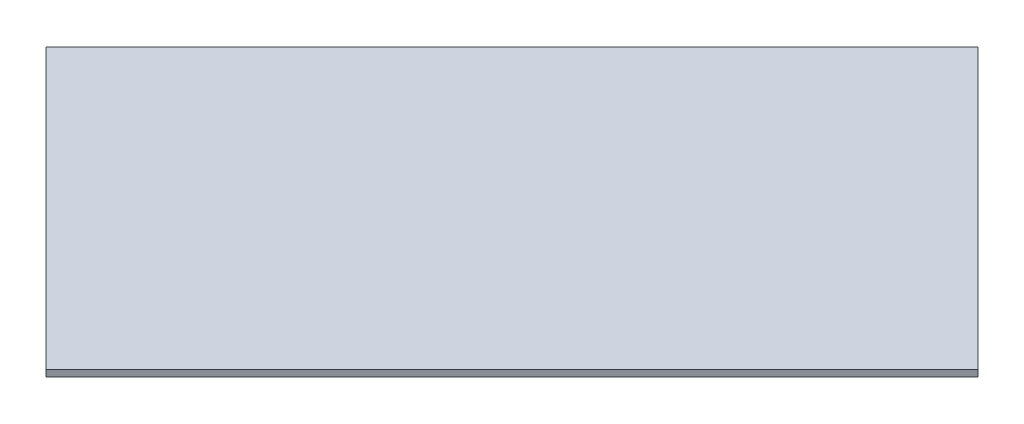
ISO-10303-21;
HEADER;
FILE_DESCRIPTION(('STEP AP214'),'2;1');
FILE_NAME('part.step','',(''),(''),'','','');
FILE_SCHEMA(('AUTOMOTIVE_DESIGN { 1 0 10303 214 1 1 1 1 }'));
ENDSEC;
DATA;
#1=APPLICATION_CONTEXT('core data for automotive mechanical design processes');
#2=APPLICATION_PROTOCOL_DEFINITION('international standard','automotive_design',2000,#1);
#3=PRODUCT_CONTEXT('',#1,'mechanical');
#4=PRODUCT('Part','Part','',(#3));
#5=PRODUCT_RELATED_PRODUCT_CATEGORY('part','',(#4));
#6=PRODUCT_DEFINITION_FORMATION('','',#4);
#7=PRODUCT_DEFINITION_CONTEXT('part definition',#1,'design');
#8=PRODUCT_DEFINITION('design','',#6,#7);
#9=PRODUCT_DEFINITION_SHAPE('','',#8);
#10=(LENGTH_UNIT() NAMED_UNIT(*) SI_UNIT(.MILLI.,.METRE.));
#11=(NAMED_UNIT(*) PLANE_ANGLE_UNIT() SI_UNIT($,.RADIAN.));
#12=(NAMED_UNIT(*) SI_UNIT($,.STERADIAN.) SOLID_ANGLE_UNIT());
#13=UNCERTAINTY_MEASURE_WITH_UNIT(LENGTH_MEASURE(1.E-05),#10,'distance_accuracy_value','');
#14=(GEOMETRIC_REPRESENTATION_CONTEXT(3) GLOBAL_UNCERTAINTY_ASSIGNED_CONTEXT((#13)) GLOBAL_UNIT_ASSIGNED_CONTEXT((#10,
#11,#12)) REPRESENTATION_CONTEXT('',''));
#15=CARTESIAN_POINT('',(0.,0.,0.));
#16=DIRECTION('',(0.,0.,1.));
#17=DIRECTION('',(1.,0.,0.));
#18=AXIS2_PLACEMENT_3D('',#15,#16,#17);
#19=CARTESIAN_POINT('',(-85.3553390593274,10.,-7.07106781186548));
#20=DIRECTION('',(-0.707106781186548,0.,0.707106781186547));
#21=DIRECTION('',(0.707106781186547,0.,0.707106781186548));
#22=AXIS2_PLACEMENT_3D('',#19,#20,#21);
#23=PLANE('',#22);
#24=DIRECTION('',(0.,1.,0.));
#25=VECTOR('',#24,1.);
#26=CARTESIAN_POINT('',(-85.3553390593274,10.,-7.07106781186548));
#27=LINE('',#26,#25);
#28=CARTESIAN_POINT('',(-85.3553390593274,10.,-7.07106781186548));
#29=VERTEX_POINT('',#28);
#30=CARTESIAN_POINT('',(-85.3553390593274,10.2,-7.07106781186548));
#31=VERTEX_POINT('',#30);
#32=EDGE_CURVE('E11',#29,#31,#27,.T.);
#33=ORIENTED_EDGE('',*,*,#32,.F.);
#34=DIRECTION('',(0.707106781186547,0.,0.707106781186548));
#35=VECTOR('',#34,1.);
#36=CARTESIAN_POINT('',(-85.3553390593274,10.,-7.07106781186548));
#37=LINE('',#36,#35);
#38=CARTESIAN_POINT('',(-76.8700576850888,10.,1.41421356237309));
#39=VERTEX_POINT('',#38);
#40=EDGE_CURVE('E88',#29,#39,#37,.T.);
#41=ORIENTED_EDGE('',*,*,#40,.T.);
#42=DIRECTION('',(0.,1.,0.));
#43=VECTOR('',#42,1.);
#44=CARTESIAN_POINT('',(-76.8700576850888,10.,1.41421356237309));
#45=LINE('',#44,#43);
#46=CARTESIAN_POINT('',(-76.8700576850888,10.2,1.41421356237309));
#47=VERTEX_POINT('',#46);
#48=EDGE_CURVE('E43',#39,#47,#45,.T.);
#49=ORIENTED_EDGE('',*,*,#48,.T.);
#50=DIRECTION('',(0.707106781186547,0.,0.707106781186548));
#51=VECTOR('',#50,1.);
#52=CARTESIAN_POINT('',(-85.3553390593274,10.2,-7.07106781186548));
#53=LINE('',#52,#51);
#54=EDGE_CURVE('E101',#31,#47,#53,.T.);
#55=ORIENTED_EDGE('',*,*,#54,.F.);
#56=EDGE_LOOP('',(#33,#41,#49,#55));
#57=FACE_BOUND('',#56,.T.);
#58=ADVANCED_FACE('F33',(#57),#23,.T.);
#59=CARTESIAN_POINT('',(-76.8700576850888,10.,1.41421356237309));
#60=DIRECTION('',(0.707106781186547,0.,0.707106781186548));
#61=DIRECTION('',(0.707106781186548,0.,-0.707106781186547));
#62=AXIS2_PLACEMENT_3D('',#59,#60,#61);
#63=PLANE('',#62);
#64=ORIENTED_EDGE('',*,*,#48,.F.);
#65=DIRECTION('',(0.707106781186548,0.,-0.707106781186547));
#66=VECTOR('',#65,1.);
#67=CARTESIAN_POINT('',(-76.8700576850888,10.,1.41421356237309));
#68=LINE('',#67,#66);
#69=CARTESIAN_POINT('',(-62.7279220613579,10.,-12.7279220613579));
#70=VERTEX_POINT('',#69);
#71=EDGE_CURVE('E95',#39,#70,#68,.T.);
#72=ORIENTED_EDGE('',*,*,#71,.T.);
#73=DIRECTION('',(0.,1.,0.));
#74=VECTOR('',#73,1.);
#75=CARTESIAN_POINT('',(-62.7279220613579,10.,-12.7279220613579));
#76=LINE('',#75,#74);
#77=CARTESIAN_POINT('',(-62.7279220613579,10.2,-12.7279220613579));
#78=VERTEX_POINT('',#77);
#79=EDGE_CURVE('E51',#70,#78,#76,.T.);
#80=ORIENTED_EDGE('',*,*,#79,.T.);
#81=DIRECTION('',(0.707106781186548,0.,-0.707106781186547));
#82=VECTOR('',#81,1.);
#83=CARTESIAN_POINT('',(-76.8700576850888,10.2,1.41421356237309));
#84=LINE('',#83,#82);
#85=EDGE_CURVE('E82',#47,#78,#84,.T.);
#86=ORIENTED_EDGE('',*,*,#85,.F.);
#87=EDGE_LOOP('',(#64,#72,#80,#86));
#88=FACE_BOUND('',#87,.T.);
#89=ADVANCED_FACE('F105',(#88),#63,.T.);
#90=CARTESIAN_POINT('',(-25.,10.,25.));
#91=DIRECTION('',(-0.707106781186548,0.,0.707106781186547));
#92=DIRECTION('',(0.707106781186547,0.,0.707106781186548));
#93=AXIS2_PLACEMENT_3D('',#90,#91,#92);
#94=PLANE('',#93);
#95=ORIENTED_EDGE('',*,*,#79,.F.);
#96=DIRECTION('',(0.707106781186547,0.,0.707106781186548));
#97=VECTOR('',#96,1.);
#98=CARTESIAN_POINT('',(-25.,10.,25.));
#99=LINE('',#98,#97);
#100=CARTESIAN_POINT('',(-71.2132034355964,10.,-21.2132034355964));
#101=VERTEX_POINT('',#100);
#102=EDGE_CURVE('E87',#101,#70,#99,.T.);
#103=ORIENTED_EDGE('',*,*,#102,.F.);
#104=DIRECTION('',(0.,1.,0.));
#105=VECTOR('',#104,1.);
#106=CARTESIAN_POINT('',(-71.2132034355964,10.,-21.2132034355964));
#107=LINE('',#106,#105);
#108=CARTESIAN_POINT('',(-71.2132034355964,10.2,-21.2132034355964));
#109=VERTEX_POINT('',#108);
#110=EDGE_CURVE('E37',#101,#109,#107,.T.);
#111=ORIENTED_EDGE('',*,*,#110,.T.);
#112=DIRECTION('',(0.707106781186547,0.,0.707106781186548));
#113=VECTOR('',#112,1.);
#114=CARTESIAN_POINT('',(-25.,10.2,25.));
#115=LINE('',#114,#113);
#116=EDGE_CURVE('E97',#109,#78,#115,.T.);
#117=ORIENTED_EDGE('',*,*,#116,.T.);
#118=EDGE_LOOP('',(#95,#103,#111,#117));
#119=FACE_BOUND('',#118,.T.);
#120=ADVANCED_FACE('F90',(#119),#94,.F.);
#121=CARTESIAN_POINT('',(-46.2132034355964,10.,-46.2132034355964));
#122=DIRECTION('',(-0.707106781186547,0.,-0.707106781186548));
#123=DIRECTION('',(-0.707106781186548,0.,0.707106781186547));
#124=AXIS2_PLACEMENT_3D('',#121,#122,#123);
#125=PLANE('',#124);
#126=DIRECTION('',(-0.707106781186548,0.,0.707106781186547));
#127=VECTOR('',#126,1.);
#128=CARTESIAN_POINT('',(-46.2132034355964,10.,-46.2132034355964));
#129=LINE('',#128,#127);
#130=EDGE_CURVE('E76',#101,#29,#129,.T.);
#131=ORIENTED_EDGE('',*,*,#130,.T.);
#132=ORIENTED_EDGE('',*,*,#32,.T.);
#133=DIRECTION('',(-0.707106781186548,0.,0.707106781186547));
#134=VECTOR('',#133,1.);
#135=CARTESIAN_POINT('',(-46.2132034355964,10.2,-46.2132034355964));
#136=LINE('',#135,#134);
#137=EDGE_CURVE('E78',#109,#31,#136,.T.);
#138=ORIENTED_EDGE('',*,*,#137,.F.);
#139=ORIENTED_EDGE('',*,*,#110,.F.);
#140=EDGE_LOOP('',(#131,#132,#138,#139));
#141=FACE_BOUND('',#140,.T.);
#142=ADVANCED_FACE('F35',(#141),#125,.T.);
#143=CARTESIAN_POINT('',(0.,10.2,0.));
#144=DIRECTION('',(0.,1.,0.));
#145=DIRECTION('',(0.,0.,1.));
#146=AXIS2_PLACEMENT_3D('',#143,#144,#145);
#147=PLANE('',#146);
#148=ORIENTED_EDGE('',*,*,#116,.F.);
#149=ORIENTED_EDGE('',*,*,#137,.T.);
#150=ORIENTED_EDGE('',*,*,#54,.T.);
#151=ORIENTED_EDGE('',*,*,#85,.T.);
#152=EDGE_LOOP('',(#148,#149,#150,#151));
#153=FACE_BOUND('',#152,.T.);
#154=ADVANCED_FACE('F104',(#153),#147,.T.);
#155=CARTESIAN_POINT('',(0.,10.,0.));
#156=DIRECTION('',(0.,1.,0.));
#157=DIRECTION('',(0.,0.,1.));
#158=AXIS2_PLACEMENT_3D('',#155,#156,#157);
#159=PLANE('',#158);
#160=ORIENTED_EDGE('',*,*,#102,.T.);
#161=ORIENTED_EDGE('',*,*,#71,.F.);
#162=ORIENTED_EDGE('',*,*,#40,.F.);
#163=ORIENTED_EDGE('',*,*,#130,.F.);
#164=EDGE_LOOP('',(#160,#161,#162,#163));
#165=FACE_BOUND('',#164,.T.);
#166=ADVANCED_FACE('F85',(#165),#159,.F.);
#167=CLOSED_SHELL('',(#58,#89,#120,#142,#154,#166));
#168=MANIFOLD_SOLID_BREP('B2',#167);
#169=ADVANCED_BREP_SHAPE_REPRESENTATION('',(#18,#168),#14);
#170=SHAPE_DEFINITION_REPRESENTATION(#9,#169);
ENDSEC;
END-ISO-10303-21;
